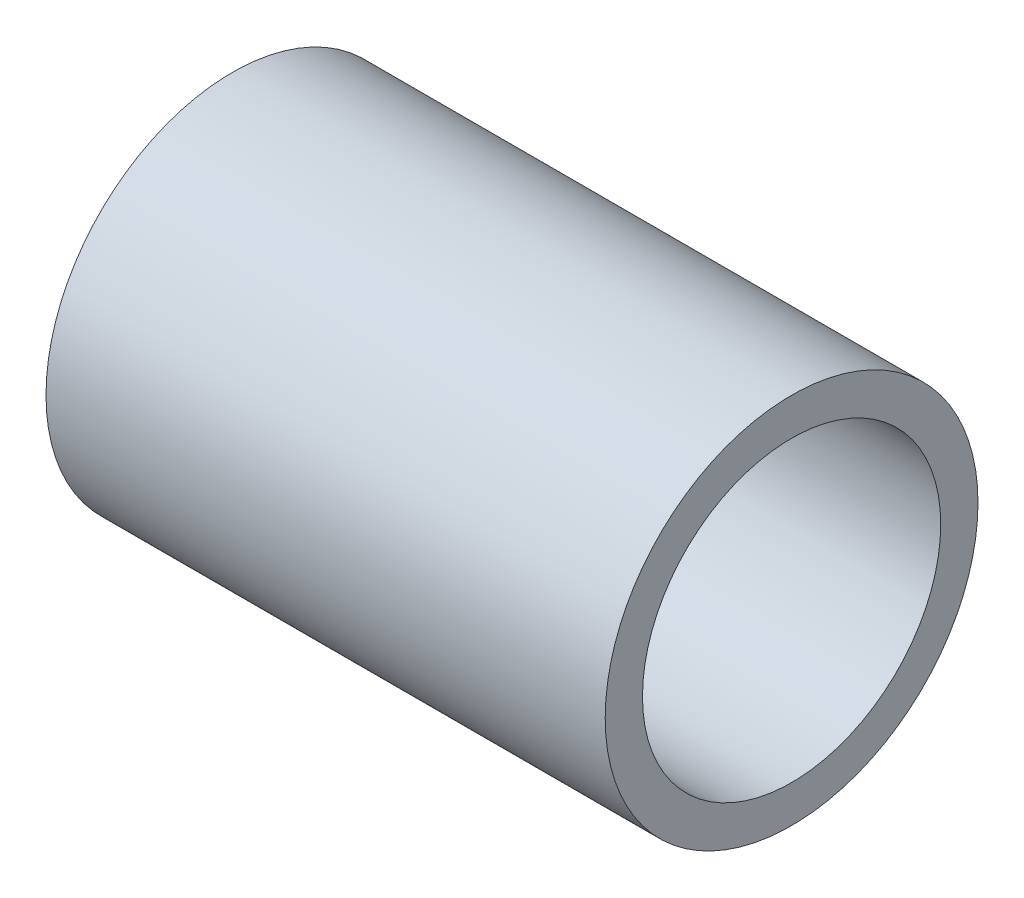
ISO-10303-21;
HEADER;
FILE_DESCRIPTION(('STEP AP214'),'2;1');
FILE_NAME('part.step','',(''),(''),'','','');
FILE_SCHEMA(('AUTOMOTIVE_DESIGN { 1 0 10303 214 1 1 1 1 }'));
ENDSEC;
DATA;
#1=APPLICATION_CONTEXT('core data for automotive mechanical design processes');
#2=APPLICATION_PROTOCOL_DEFINITION('international standard','automotive_design',2000,#1);
#3=PRODUCT_CONTEXT('',#1,'mechanical');
#4=PRODUCT('Part','Part','',(#3));
#5=PRODUCT_RELATED_PRODUCT_CATEGORY('part','',(#4));
#6=PRODUCT_DEFINITION_FORMATION('','',#4);
#7=PRODUCT_DEFINITION_CONTEXT('part definition',#1,'design');
#8=PRODUCT_DEFINITION('design','',#6,#7);
#9=PRODUCT_DEFINITION_SHAPE('','',#8);
#10=(LENGTH_UNIT() NAMED_UNIT(*) SI_UNIT(.MILLI.,.METRE.));
#11=(NAMED_UNIT(*) PLANE_ANGLE_UNIT() SI_UNIT($,.RADIAN.));
#12=(NAMED_UNIT(*) SI_UNIT($,.STERADIAN.) SOLID_ANGLE_UNIT());
#13=UNCERTAINTY_MEASURE_WITH_UNIT(LENGTH_MEASURE(1.E-05),#10,'distance_accuracy_value','');
#14=(GEOMETRIC_REPRESENTATION_CONTEXT(3) GLOBAL_UNCERTAINTY_ASSIGNED_CONTEXT((#13)) GLOBAL_UNIT_ASSIGNED_CONTEXT((#10,
#11,#12)) REPRESENTATION_CONTEXT('',''));
#15=CARTESIAN_POINT('',(0.,0.,0.));
#16=DIRECTION('',(0.,0.,1.));
#17=DIRECTION('',(1.,0.,0.));
#18=AXIS2_PLACEMENT_3D('',#15,#16,#17);
#19=CARTESIAN_POINT('',(15.,0.,0.));
#20=DIRECTION('',(1.,0.,0.));
#21=DIRECTION('',(0.,0.,-1.));
#22=AXIS2_PLACEMENT_3D('',#19,#20,#21);
#23=PLANE('',#22);
#24=CARTESIAN_POINT('',(15.,0.,0.));
#25=DIRECTION('',(1.,0.,0.));
#26=DIRECTION('',(0.,0.,-1.));
#27=AXIS2_PLACEMENT_3D('',#24,#25,#26);
#28=CIRCLE('',#27,5.);
#29=CARTESIAN_POINT('',(15.,0.,-5.));
#30=VERTEX_POINT('',#29);
#31=EDGE_CURVE('E10',#30,#30,#28,.T.);
#32=ORIENTED_EDGE('',*,*,#31,.T.);
#33=EDGE_LOOP('',(#32));
#34=FACE_BOUND('',#33,.T.);
#35=CARTESIAN_POINT('',(15.,0.,0.));
#36=DIRECTION('',(1.,0.,0.));
#37=DIRECTION('',(0.,0.,-1.));
#38=AXIS2_PLACEMENT_3D('',#35,#36,#37);
#39=CIRCLE('',#38,4.);
#40=CARTESIAN_POINT('',(15.,0.,-4.));
#41=VERTEX_POINT('',#40);
#42=EDGE_CURVE('E42',#41,#41,#39,.T.);
#43=ORIENTED_EDGE('',*,*,#42,.F.);
#44=EDGE_LOOP('',(#43));
#45=FACE_BOUND('',#44,.T.);
#46=ADVANCED_FACE('F31',(#34,#45),#23,.T.);
#47=CARTESIAN_POINT('',(0.,0.,0.));
#48=DIRECTION('',(1.,0.,0.));
#49=DIRECTION('',(0.,0.,-1.));
#50=AXIS2_PLACEMENT_3D('',#47,#48,#49);
#51=PLANE('',#50);
#52=CARTESIAN_POINT('',(0.,0.,0.));
#53=DIRECTION('',(1.,0.,0.));
#54=DIRECTION('',(0.,0.,-1.));
#55=AXIS2_PLACEMENT_3D('',#52,#53,#54);
#56=CIRCLE('',#55,5.);
#57=CARTESIAN_POINT('',(0.,0.,-5.));
#58=VERTEX_POINT('',#57);
#59=EDGE_CURVE('E35',#58,#58,#56,.T.);
#60=ORIENTED_EDGE('',*,*,#59,.F.);
#61=EDGE_LOOP('',(#60));
#62=FACE_BOUND('',#61,.T.);
#63=CARTESIAN_POINT('',(0.,0.,0.));
#64=DIRECTION('',(1.,0.,0.));
#65=DIRECTION('',(0.,0.,-1.));
#66=AXIS2_PLACEMENT_3D('',#63,#64,#65);
#67=CIRCLE('',#66,4.);
#68=CARTESIAN_POINT('',(0.,0.,-4.));
#69=VERTEX_POINT('',#68);
#70=EDGE_CURVE('E44',#69,#69,#67,.T.);
#71=ORIENTED_EDGE('',*,*,#70,.T.);
#72=EDGE_LOOP('',(#71));
#73=FACE_BOUND('',#72,.T.);
#74=ADVANCED_FACE('F54',(#62,#73),#51,.F.);
#75=CARTESIAN_POINT('',(15.,0.,0.));
#76=DIRECTION('',(-1.,0.,0.));
#77=DIRECTION('',(0.,0.,1.));
#78=AXIS2_PLACEMENT_3D('',#75,#76,#77);
#79=CYLINDRICAL_SURFACE('',#78,5.);
#80=ORIENTED_EDGE('',*,*,#31,.F.);
#81=EDGE_LOOP('',(#80));
#82=FACE_BOUND('',#81,.T.);
#83=ORIENTED_EDGE('',*,*,#59,.T.);
#84=EDGE_LOOP('',(#83));
#85=FACE_BOUND('',#84,.T.);
#86=ADVANCED_FACE('F33',(#82,#85),#79,.T.);
#87=CARTESIAN_POINT('',(15.,0.,0.));
#88=DIRECTION('',(-1.,0.,0.));
#89=DIRECTION('',(0.,0.,1.));
#90=AXIS2_PLACEMENT_3D('',#87,#88,#89);
#91=CYLINDRICAL_SURFACE('',#90,4.);
#92=ORIENTED_EDGE('',*,*,#42,.T.);
#93=EDGE_LOOP('',(#92));
#94=FACE_BOUND('',#93,.T.);
#95=ORIENTED_EDGE('',*,*,#70,.F.);
#96=EDGE_LOOP('',(#95));
#97=FACE_BOUND('',#96,.T.);
#98=ADVANCED_FACE('F50',(#94,#97),#91,.F.);
#99=CLOSED_SHELL('',(#46,#74,#86,#98));
#100=MANIFOLD_SOLID_BREP('B2',#99);
#101=ADVANCED_BREP_SHAPE_REPRESENTATION('',(#18,#100),#14);
#102=SHAPE_DEFINITION_REPRESENTATION(#9,#101);
ENDSEC;
END-ISO-10303-21;
